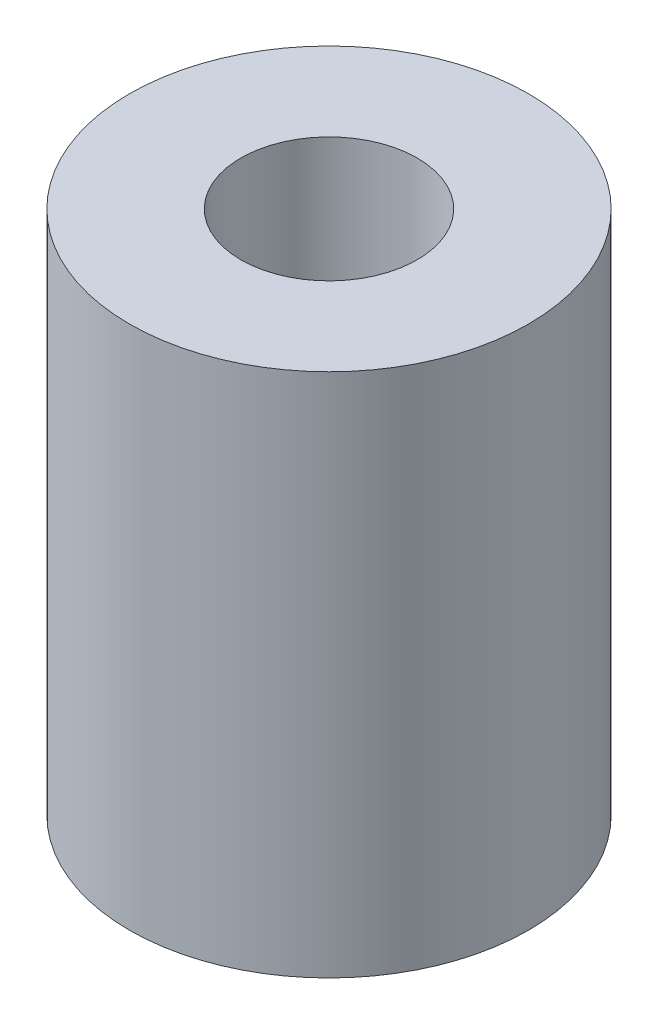
ISO-10303-21;
HEADER;
FILE_DESCRIPTION(('STEP AP214'),'2;1');
FILE_NAME('part.step','',(''),(''),'','','');
FILE_SCHEMA(('AUTOMOTIVE_DESIGN { 1 0 10303 214 1 1 1 1 }'));
ENDSEC;
DATA;
#1=APPLICATION_CONTEXT('core data for automotive mechanical design processes');
#2=APPLICATION_PROTOCOL_DEFINITION('international standard','automotive_design',2000,#1);
#3=PRODUCT_CONTEXT('',#1,'mechanical');
#4=PRODUCT('Part','Part','',(#3));
#5=PRODUCT_RELATED_PRODUCT_CATEGORY('part','',(#4));
#6=PRODUCT_DEFINITION_FORMATION('','',#4);
#7=PRODUCT_DEFINITION_CONTEXT('part definition',#1,'design');
#8=PRODUCT_DEFINITION('design','',#6,#7);
#9=PRODUCT_DEFINITION_SHAPE('','',#8);
#10=(LENGTH_UNIT() NAMED_UNIT(*) SI_UNIT(.MILLI.,.METRE.));
#11=(NAMED_UNIT(*) PLANE_ANGLE_UNIT() SI_UNIT($,.RADIAN.));
#12=(NAMED_UNIT(*) SI_UNIT($,.STERADIAN.) SOLID_ANGLE_UNIT());
#13=UNCERTAINTY_MEASURE_WITH_UNIT(LENGTH_MEASURE(1.E-05),#10,'distance_accuracy_value','');
#14=(GEOMETRIC_REPRESENTATION_CONTEXT(3) GLOBAL_UNCERTAINTY_ASSIGNED_CONTEXT((#13)) GLOBAL_UNIT_ASSIGNED_CONTEXT((#10,
#11,#12)) REPRESENTATION_CONTEXT('',''));
#15=CARTESIAN_POINT('',(0.,0.,0.));
#16=DIRECTION('',(0.,0.,1.));
#17=DIRECTION('',(1.,0.,0.));
#18=AXIS2_PLACEMENT_3D('',#15,#16,#17);
#19=CARTESIAN_POINT('',(0.,25.,0.));
#20=DIRECTION('',(0.,-1.,0.));
#21=DIRECTION('',(0.,0.,-1.));
#22=AXIS2_PLACEMENT_3D('',#19,#20,#21);
#23=CYLINDRICAL_SURFACE('',#22,3.2);
#24=CARTESIAN_POINT('',(0.,0.,0.));
#25=DIRECTION('',(0.,1.,0.));
#26=DIRECTION('',(0.,0.,1.));
#27=AXIS2_PLACEMENT_3D('',#24,#25,#26);
#28=CIRCLE('',#27,3.2);
#29=CARTESIAN_POINT('',(0.,0.,3.2));
#30=VERTEX_POINT('',#29);
#31=EDGE_CURVE('E52',#30,#30,#28,.T.);
#32=ORIENTED_EDGE('',*,*,#31,.F.);
#33=EDGE_LOOP('',(#32));
#34=FACE_BOUND('',#33,.T.);
#35=CARTESIAN_POINT('',(0.,12.5,0.));
#36=DIRECTION('',(0.,1.,0.));
#37=DIRECTION('',(0.,0.,1.));
#38=AXIS2_PLACEMENT_3D('',#35,#36,#37);
#39=CIRCLE('',#38,3.2);
#40=CARTESIAN_POINT('',(0.,12.5,3.2));
#41=VERTEX_POINT('',#40);
#42=EDGE_CURVE('E41',#41,#41,#39,.T.);
#43=ORIENTED_EDGE('',*,*,#42,.T.);
#44=EDGE_LOOP('',(#43));
#45=FACE_BOUND('',#44,.T.);
#46=ADVANCED_FACE('F37',(#34,#45),#23,.F.);
#47=CARTESIAN_POINT('',(0.,25.,0.));
#48=DIRECTION('',(0.,1.,0.));
#49=DIRECTION('',(0.,0.,1.));
#50=AXIS2_PLACEMENT_3D('',#47,#48,#49);
#51=PLANE('',#50);
#52=CARTESIAN_POINT('',(0.,25.,0.));
#53=DIRECTION('',(0.,1.,0.));
#54=DIRECTION('',(0.,0.,1.));
#55=AXIS2_PLACEMENT_3D('',#52,#53,#54);
#56=CIRCLE('',#55,4.2);
#57=CARTESIAN_POINT('',(0.,25.,4.2));
#58=VERTEX_POINT('',#57);
#59=EDGE_CURVE('E57',#58,#58,#56,.T.);
#60=ORIENTED_EDGE('',*,*,#59,.F.);
#61=EDGE_LOOP('',(#60));
#62=FACE_BOUND('',#61,.T.);
#63=CARTESIAN_POINT('',(0.,25.,0.));
#64=DIRECTION('',(0.,1.,0.));
#65=DIRECTION('',(0.,0.,1.));
#66=AXIS2_PLACEMENT_3D('',#63,#64,#65);
#67=CIRCLE('',#66,9.5);
#68=CARTESIAN_POINT('',(0.,25.,9.5));
#69=VERTEX_POINT('',#68);
#70=EDGE_CURVE('E10',#69,#69,#67,.T.);
#71=ORIENTED_EDGE('',*,*,#70,.T.);
#72=EDGE_LOOP('',(#71));
#73=FACE_BOUND('',#72,.T.);
#74=ADVANCED_FACE('F81',(#62,#73),#51,.T.);
#75=CARTESIAN_POINT('',(0.,0.,0.));
#76=DIRECTION('',(0.,1.,0.));
#77=DIRECTION('',(0.,0.,1.));
#78=AXIS2_PLACEMENT_3D('',#75,#76,#77);
#79=PLANE('',#78);
#80=CARTESIAN_POINT('',(0.,0.,0.));
#81=DIRECTION('',(0.,1.,0.));
#82=DIRECTION('',(0.,0.,1.));
#83=AXIS2_PLACEMENT_3D('',#80,#81,#82);
#84=CIRCLE('',#83,9.5);
#85=CARTESIAN_POINT('',(0.,0.,9.5));
#86=VERTEX_POINT('',#85);
#87=EDGE_CURVE('E46',#86,#86,#84,.T.);
#88=ORIENTED_EDGE('',*,*,#87,.F.);
#89=EDGE_LOOP('',(#88));
#90=FACE_BOUND('',#89,.T.);
#91=ORIENTED_EDGE('',*,*,#31,.T.);
#92=EDGE_LOOP('',(#91));
#93=FACE_BOUND('',#92,.T.);
#94=ADVANCED_FACE('F87',(#90,#93),#79,.F.);
#95=CARTESIAN_POINT('',(0.,25.,0.));
#96=DIRECTION('',(0.,-1.,0.));
#97=DIRECTION('',(0.,0.,-1.));
#98=AXIS2_PLACEMENT_3D('',#95,#96,#97);
#99=CYLINDRICAL_SURFACE('',#98,9.5);
#100=ORIENTED_EDGE('',*,*,#70,.F.);
#101=EDGE_LOOP('',(#100));
#102=FACE_BOUND('',#101,.T.);
#103=ORIENTED_EDGE('',*,*,#87,.T.);
#104=EDGE_LOOP('',(#103));
#105=FACE_BOUND('',#104,.T.);
#106=ADVANCED_FACE('F39',(#102,#105),#99,.T.);
#107=CARTESIAN_POINT('',(0.,12.5,0.));
#108=DIRECTION('',(0.,1.,0.));
#109=DIRECTION('',(0.,0.,1.));
#110=AXIS2_PLACEMENT_3D('',#107,#108,#109);
#111=CYLINDRICAL_SURFACE('',#110,4.2);
#112=CARTESIAN_POINT('',(0.,12.5,0.));
#113=DIRECTION('',(0.,1.,0.));
#114=DIRECTION('',(0.,0.,1.));
#115=AXIS2_PLACEMENT_3D('',#112,#113,#114);
#116=CIRCLE('',#115,4.2);
#117=CARTESIAN_POINT('',(0.,12.5,4.2));
#118=VERTEX_POINT('',#117);
#119=EDGE_CURVE('E61',#118,#118,#116,.T.);
#120=ORIENTED_EDGE('',*,*,#119,.F.);
#121=EDGE_LOOP('',(#120));
#122=FACE_BOUND('',#121,.T.);
#123=ORIENTED_EDGE('',*,*,#59,.T.);
#124=EDGE_LOOP('',(#123));
#125=FACE_BOUND('',#124,.T.);
#126=ADVANCED_FACE('F73',(#122,#125),#111,.F.);
#127=CARTESIAN_POINT('',(0.,12.5,0.));
#128=DIRECTION('',(0.,1.,0.));
#129=DIRECTION('',(0.,0.,1.));
#130=AXIS2_PLACEMENT_3D('',#127,#128,#129);
#131=PLANE('',#130);
#132=ORIENTED_EDGE('',*,*,#42,.F.);
#133=EDGE_LOOP('',(#132));
#134=FACE_BOUND('',#133,.T.);
#135=ORIENTED_EDGE('',*,*,#119,.T.);
#136=EDGE_LOOP('',(#135));
#137=FACE_BOUND('',#136,.T.);
#138=ADVANCED_FACE('F71',(#134,#137),#131,.T.);
#139=CLOSED_SHELL('',(#46,#74,#94,#106,#126,#138));
#140=MANIFOLD_SOLID_BREP('B2',#139);
#141=ADVANCED_BREP_SHAPE_REPRESENTATION('',(#18,#140),#14);
#142=SHAPE_DEFINITION_REPRESENTATION(#9,#141);
ENDSEC;
END-ISO-10303-21;
